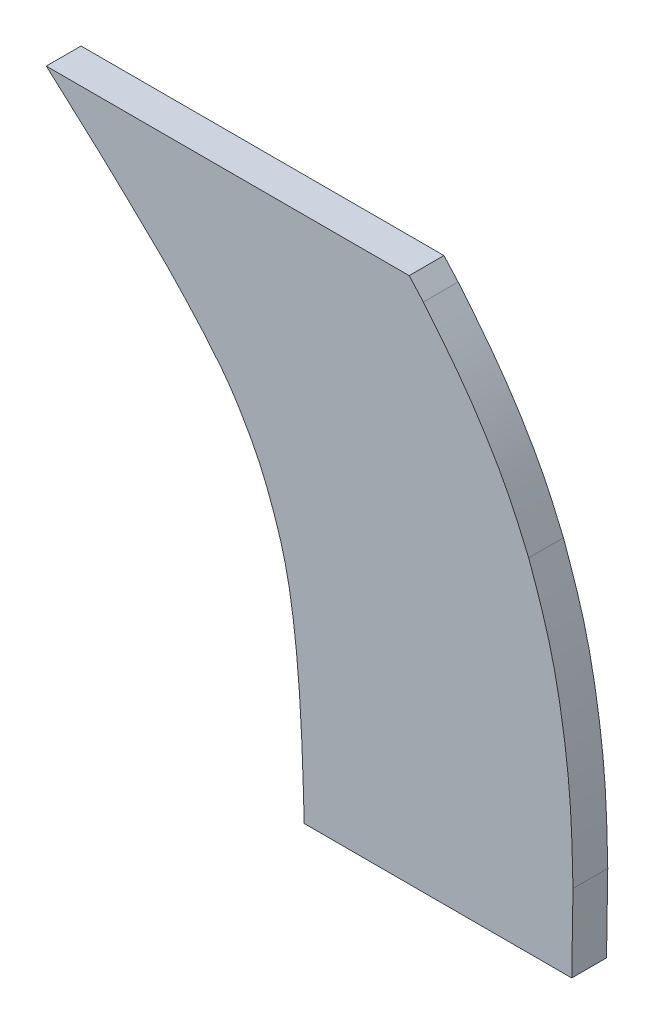
ISO-10303-21;
HEADER;
FILE_DESCRIPTION(('STEP AP214'),'2;1');
FILE_NAME('part.step','',(''),(''),'','','');
FILE_SCHEMA(('AUTOMOTIVE_DESIGN { 1 0 10303 214 1 1 1 1 }'));
ENDSEC;
DATA;
#1=APPLICATION_CONTEXT('core data for automotive mechanical design processes');
#2=APPLICATION_PROTOCOL_DEFINITION('international standard','automotive_design',2000,#1);
#3=PRODUCT_CONTEXT('',#1,'mechanical');
#4=PRODUCT('Part','Part','',(#3));
#5=PRODUCT_RELATED_PRODUCT_CATEGORY('part','',(#4));
#6=PRODUCT_DEFINITION_FORMATION('','',#4);
#7=PRODUCT_DEFINITION_CONTEXT('part definition',#1,'design');
#8=PRODUCT_DEFINITION('design','',#6,#7);
#9=PRODUCT_DEFINITION_SHAPE('','',#8);
#10=(LENGTH_UNIT() NAMED_UNIT(*) SI_UNIT(.MILLI.,.METRE.));
#11=(NAMED_UNIT(*) PLANE_ANGLE_UNIT() SI_UNIT($,.RADIAN.));
#12=(NAMED_UNIT(*) SI_UNIT($,.STERADIAN.) SOLID_ANGLE_UNIT());
#13=UNCERTAINTY_MEASURE_WITH_UNIT(LENGTH_MEASURE(1.E-05),#10,'distance_accuracy_value','');
#14=(GEOMETRIC_REPRESENTATION_CONTEXT(3) GLOBAL_UNCERTAINTY_ASSIGNED_CONTEXT((#13)) GLOBAL_UNIT_ASSIGNED_CONTEXT((#10,
#11,#12)) REPRESENTATION_CONTEXT('',''));
#15=CARTESIAN_POINT('',(0.,0.,0.));
#16=DIRECTION('',(0.,0.,1.));
#17=DIRECTION('',(1.,0.,0.));
#18=AXIS2_PLACEMENT_3D('',#15,#16,#17);
#19=CARTESIAN_POINT('',(1.68870192307694,-3.15504807692308,0.5));
#20=CARTESIAN_POINT('',(1.60232763222018,-2.95289779767821,0.5));
#21=CARTESIAN_POINT('',(1.42460448924147,-2.53695478240067,0.5));
#22=CARTESIAN_POINT('',(1.07669462399531,-1.93136088188836,0.5));
#23=CARTESIAN_POINT('',(0.660414537092791,-1.32069011766099,0.5));
#24=CARTESIAN_POINT('',(0.339681018973926,-0.929104196150406,0.5));
#25=CARTESIAN_POINT('',(0.174278846153862,-0.727163461538463,0.5));
#26=B_SPLINE_CURVE_WITH_KNOTS('',3,(#19,#20,#21,#22,#23,#24,#25),.UNSPECIFIED.,.F.,.F.,(4,1,1,1,
4),(0.,0.229314447401135,0.471835819643835,0.727625900937919,1.),.UNSPECIFIED.);
#27=DIRECTION('',(0.,0.,-1.));
#28=VECTOR('',#27,1.);
#29=SURFACE_OF_LINEAR_EXTRUSION('',#26,#28);
#30=CARTESIAN_POINT('',(1.68870192307694,-3.15504807692308,0.));
#31=CARTESIAN_POINT('',(1.60232763222018,-2.95289779767821,0.));
#32=CARTESIAN_POINT('',(1.42460448924147,-2.53695478240067,0.));
#33=CARTESIAN_POINT('',(1.07669462399531,-1.93136088188836,0.));
#34=CARTESIAN_POINT('',(0.660414537092791,-1.32069011766099,0.));
#35=CARTESIAN_POINT('',(0.339681018973926,-0.929104196150406,0.));
#36=CARTESIAN_POINT('',(0.174278846153862,-0.727163461538463,0.));
#37=B_SPLINE_CURVE_WITH_KNOTS('',3,(#30,#31,#32,#33,#34,#35,#36),.UNSPECIFIED.,.F.,.F.,(4,1,1,1,
4),(0.,0.229314447401135,0.471835819643835,0.727625900937919,1.),.UNSPECIFIED.);
#38=CARTESIAN_POINT('',(1.68870192307694,-3.15504807692308,0.));
#39=VERTEX_POINT('',#38);
#40=CARTESIAN_POINT('',(0.174278846153862,-0.727163461538463,0.));
#41=VERTEX_POINT('',#40);
#42=EDGE_CURVE('E118',#39,#41,#37,.T.);
#43=ORIENTED_EDGE('',*,*,#42,.T.);
#44=DIRECTION('',(0.,0.,-1.));
#45=VECTOR('',#44,1.);
#46=CARTESIAN_POINT('',(0.174278846153862,-0.727163461538463,0.5));
#47=LINE('',#46,#45);
#48=CARTESIAN_POINT('',(0.174278846153862,-0.727163461538463,0.5));
#49=VERTEX_POINT('',#48);
#50=EDGE_CURVE('E116',#49,#41,#47,.T.);
#51=ORIENTED_EDGE('',*,*,#50,.F.);
#52=CARTESIAN_POINT('',(1.68870192307694,-3.15504807692308,0.5));
#53=VERTEX_POINT('',#52);
#54=EDGE_CURVE('E201',#53,#49,#26,.T.);
#55=ORIENTED_EDGE('',*,*,#54,.F.);
#56=DIRECTION('',(0.,0.,-1.));
#57=VECTOR('',#56,1.);
#58=CARTESIAN_POINT('',(1.68870192307694,-3.15504807692308,0.5));
#59=LINE('',#58,#57);
#60=EDGE_CURVE('E152',#53,#39,#59,.T.);
#61=ORIENTED_EDGE('',*,*,#60,.T.);
#62=EDGE_LOOP('',(#43,#51,#55,#61));
#63=FACE_BOUND('',#62,.T.);
#64=ADVANCED_FACE('F39',(#63),#29,.F.);
#65=CARTESIAN_POINT('',(2.32572115384617,-6.953125,0.5));
#66=CARTESIAN_POINT('',(2.31796427184218,-6.59813381025928,0.5));
#67=CARTESIAN_POINT('',(2.30297263097523,-5.91204622702826,0.5));
#68=CARTESIAN_POINT('',(2.17906008741319,-4.92115731738626,0.5));
#69=CARTESIAN_POINT('',(1.9903794108285,-4.00207443127874,0.5));
#70=CARTESIAN_POINT('',(1.78721405775447,-3.43164271087344,0.5));
#71=CARTESIAN_POINT('',(1.68870192307694,-3.15504807692308,0.5));
#72=B_SPLINE_CURVE_WITH_KNOTS('',3,(#65,#66,#67,#68,#69,#70,#71),.UNSPECIFIED.,.F.,.F.,(4,1,1,1,
4),(0.,0.274928014115547,0.531350360849249,0.772758122041731,1.),.UNSPECIFIED.);
#73=DIRECTION('',(0.,0.,-1.));
#74=VECTOR('',#73,1.);
#75=SURFACE_OF_LINEAR_EXTRUSION('',#72,#74);
#76=CARTESIAN_POINT('',(2.32572115384617,-6.953125,0.));
#77=CARTESIAN_POINT('',(2.31796427184218,-6.59813381025928,0.));
#78=CARTESIAN_POINT('',(2.30297263097523,-5.91204622702826,0.));
#79=CARTESIAN_POINT('',(2.17906008741319,-4.92115731738626,0.));
#80=CARTESIAN_POINT('',(1.9903794108285,-4.00207443127874,0.));
#81=CARTESIAN_POINT('',(1.78721405775447,-3.43164271087344,0.));
#82=CARTESIAN_POINT('',(1.68870192307694,-3.15504807692308,0.));
#83=B_SPLINE_CURVE_WITH_KNOTS('',3,(#76,#77,#78,#79,#80,#81,#82),.UNSPECIFIED.,.F.,.F.,(4,1,1,1,
4),(0.,0.274928014115547,0.531350360849249,0.772758122041731,1.),.UNSPECIFIED.);
#84=CARTESIAN_POINT('',(2.32572115384617,-6.953125,0.));
#85=VERTEX_POINT('',#84);
#86=EDGE_CURVE('E125',#85,#39,#83,.T.);
#87=ORIENTED_EDGE('',*,*,#86,.T.);
#88=ORIENTED_EDGE('',*,*,#60,.F.);
#89=CARTESIAN_POINT('',(2.32572115384617,-6.953125,0.5));
#90=VERTEX_POINT('',#89);
#91=EDGE_CURVE('E213',#90,#53,#72,.T.);
#92=ORIENTED_EDGE('',*,*,#91,.F.);
#93=DIRECTION('',(0.,0.,-1.));
#94=VECTOR('',#93,1.);
#95=CARTESIAN_POINT('',(2.32572115384617,-6.953125,0.5));
#96=LINE('',#95,#94);
#97=EDGE_CURVE('E149',#90,#85,#96,.T.);
#98=ORIENTED_EDGE('',*,*,#97,.T.);
#99=EDGE_LOOP('',(#87,#88,#92,#98));
#100=FACE_BOUND('',#99,.T.);
#101=ADVANCED_FACE('F230',(#100),#75,.F.);
#102=CARTESIAN_POINT('',(2.30769230769232,-8.07692307692308,0.5));
#103=CARTESIAN_POINT('',(2.31205045037917,-7.85857919950495,0.5));
#104=CARTESIAN_POINT('',(2.31952699537485,-7.48400270182074,0.5));
#105=CARTESIAN_POINT('',(2.32389803217099,-7.10937780650145,0.5));
#106=CARTESIAN_POINT('',(2.32572115384617,-6.953125,0.5));
#107=B_SPLINE_CURVE_WITH_KNOTS('',3,(#102,#103,#104,#105,#106),.UNSPECIFIED.,.F.,.F.,(4,1,4),
(0.,0.582908641540579,1.),.UNSPECIFIED.);
#108=DIRECTION('',(0.,0.,-1.));
#109=VECTOR('',#108,1.);
#110=SURFACE_OF_LINEAR_EXTRUSION('',#107,#109);
#111=CARTESIAN_POINT('',(2.30769230769232,-8.07692307692308,0.));
#112=CARTESIAN_POINT('',(2.31205045037917,-7.85857919950495,0.));
#113=CARTESIAN_POINT('',(2.31952699537485,-7.48400270182074,0.));
#114=CARTESIAN_POINT('',(2.32389803217099,-7.10937780650145,0.));
#115=CARTESIAN_POINT('',(2.32572115384617,-6.953125,0.));
#116=B_SPLINE_CURVE_WITH_KNOTS('',3,(#111,#112,#113,#114,#115),.UNSPECIFIED.,.F.,.F.,(4,1,4),
(0.,0.582908641540579,1.),.UNSPECIFIED.);
#117=CARTESIAN_POINT('',(2.30769230769232,-8.07692307692308,0.));
#118=VERTEX_POINT('',#117);
#119=EDGE_CURVE('E243',#118,#85,#116,.T.);
#120=ORIENTED_EDGE('',*,*,#119,.T.);
#121=ORIENTED_EDGE('',*,*,#97,.F.);
#122=CARTESIAN_POINT('',(2.30769230769232,-8.07692307692308,0.5));
#123=VERTEX_POINT('',#122);
#124=EDGE_CURVE('E219',#123,#90,#107,.T.);
#125=ORIENTED_EDGE('',*,*,#124,.F.);
#126=DIRECTION('',(0.,0.,-1.));
#127=VECTOR('',#126,1.);
#128=CARTESIAN_POINT('',(2.30769230769232,-8.07692307692308,0.5));
#129=LINE('',#128,#127);
#130=EDGE_CURVE('E47',#123,#118,#129,.T.);
#131=ORIENTED_EDGE('',*,*,#130,.T.);
#132=EDGE_LOOP('',(#120,#121,#125,#131));
#133=FACE_BOUND('',#132,.T.);
#134=ADVANCED_FACE('F227',(#133),#110,.F.);
#135=CARTESIAN_POINT('',(-1.53846153846152,-8.07692307692308,0.5));
#136=DIRECTION('',(0.,1.,0.));
#137=DIRECTION('',(0.,0.,1.));
#138=AXIS2_PLACEMENT_3D('',#135,#136,#137);
#139=PLANE('',#138);
#140=DIRECTION('',(1.,0.,0.));
#141=VECTOR('',#140,1.);
#142=CARTESIAN_POINT('',(-1.53846153846152,-8.07692307692308,0.));
#143=LINE('',#142,#141);
#144=CARTESIAN_POINT('',(-1.53846153846152,-8.07692307692308,0.));
#145=VERTEX_POINT('',#144);
#146=EDGE_CURVE('E107',#145,#118,#143,.T.);
#147=ORIENTED_EDGE('',*,*,#146,.T.);
#148=ORIENTED_EDGE('',*,*,#130,.F.);
#149=DIRECTION('',(1.,0.,0.));
#150=VECTOR('',#149,1.);
#151=CARTESIAN_POINT('',(-1.53846153846152,-8.07692307692308,0.5));
#152=LINE('',#151,#150);
#153=CARTESIAN_POINT('',(-1.53846153846152,-8.07692307692308,0.5));
#154=VERTEX_POINT('',#153);
#155=EDGE_CURVE('E256',#154,#123,#152,.T.);
#156=ORIENTED_EDGE('',*,*,#155,.F.);
#157=DIRECTION('',(0.,0.,-1.));
#158=VECTOR('',#157,1.);
#159=CARTESIAN_POINT('',(-1.53846153846152,-8.07692307692308,0.5));
#160=LINE('',#159,#158);
#161=EDGE_CURVE('E160',#154,#145,#160,.T.);
#162=ORIENTED_EDGE('',*,*,#161,.T.);
#163=EDGE_LOOP('',(#147,#148,#156,#162));
#164=FACE_BOUND('',#163,.T.);
#165=ADVANCED_FACE('F41',(#164),#139,.F.);
#166=CARTESIAN_POINT('',(-5.04807692307691,-0.67908653846154,0.5));
#167=CARTESIAN_POINT('',(-4.90368534601218,-0.809107376099954,0.5));
#168=CARTESIAN_POINT('',(-4.62551254435876,-1.05959470655545,0.5));
#169=CARTESIAN_POINT('',(-4.22779883738874,-1.42304971681978,0.5));
#170=CARTESIAN_POINT('',(-3.87803267503722,-1.76869920695732,0.5));
#171=CARTESIAN_POINT('',(-3.55255317793362,-2.07217325874222,0.5));
#172=CARTESIAN_POINT('',(-3.28007793907462,-2.36082818712014,0.5));
#173=CARTESIAN_POINT('',(-3.04221671604907,-2.62013020696313,0.5));
#174=CARTESIAN_POINT('',(-2.84582542706802,-2.85426776546625,0.5));
#175=CARTESIAN_POINT('',(-2.62645535125399,-3.12362356381901,0.5));
#176=CARTESIAN_POINT('',(-2.41006632825114,-3.4682993783295,0.5));
#177=CARTESIAN_POINT('',(-2.1767170662385,-3.89257628938993,0.5));
#178=CARTESIAN_POINT('',(-1.99494127263021,-4.35511678292371,0.5));
#179=CARTESIAN_POINT('',(-1.82704843280044,-4.85981415090261,0.5));
#180=CARTESIAN_POINT('',(-1.70826736927876,-5.46273270330076,0.5));
#181=CARTESIAN_POINT('',(-1.62325467335431,-6.19593829041788,0.5));
#182=CARTESIAN_POINT('',(-1.56618741980453,-7.08459474940085,0.5));
#183=CARTESIAN_POINT('',(-1.54820264233609,-7.72828228183067,0.5));
#184=CARTESIAN_POINT('',(-1.53846153846152,-8.07692307692308,0.5));
#185=B_SPLINE_CURVE_WITH_KNOTS('',3,(#166,#167,#168,#169,#170,#171,#172,#173,#174,#175,#176,
#177,#178,#179,#180,#181,#182,#183,#184),.UNSPECIFIED.,.F.,.F.,(4,1,1,1,1,1,1,1,1,1,1,1,1,1,1,1,
4),(0.,0.0678143802654593,0.130645544112154,0.187998736302446,0.239420704509847,
0.285900177766897,0.326485127592665,0.362201744583584,0.392555032416286,0.447625777948467,
0.503925344749419,0.561308356256565,0.620782657638053,0.689338944965152,0.775273518007204,
0.87828128492013,1.),.UNSPECIFIED.);
#186=DIRECTION('',(0.,0.,-1.));
#187=VECTOR('',#186,1.);
#188=SURFACE_OF_LINEAR_EXTRUSION('',#185,#187);
#189=CARTESIAN_POINT('',(-5.04807692307691,-0.67908653846154,0.));
#190=CARTESIAN_POINT('',(-4.90368534601218,-0.809107376099954,0.));
#191=CARTESIAN_POINT('',(-4.62551254435876,-1.05959470655545,0.));
#192=CARTESIAN_POINT('',(-4.22779883738874,-1.42304971681978,0.));
#193=CARTESIAN_POINT('',(-3.87803267503722,-1.76869920695732,0.));
#194=CARTESIAN_POINT('',(-3.55255317793362,-2.07217325874222,0.));
#195=CARTESIAN_POINT('',(-3.28007793907462,-2.36082818712014,0.));
#196=CARTESIAN_POINT('',(-3.04221671604907,-2.62013020696313,0.));
#197=CARTESIAN_POINT('',(-2.84582542706802,-2.85426776546625,0.));
#198=CARTESIAN_POINT('',(-2.62645535125399,-3.12362356381901,0.));
#199=CARTESIAN_POINT('',(-2.41006632825114,-3.4682993783295,0.));
#200=CARTESIAN_POINT('',(-2.1767170662385,-3.89257628938993,0.));
#201=CARTESIAN_POINT('',(-1.99494127263021,-4.35511678292371,0.));
#202=CARTESIAN_POINT('',(-1.82704843280044,-4.85981415090261,0.));
#203=CARTESIAN_POINT('',(-1.70826736927876,-5.46273270330076,0.));
#204=CARTESIAN_POINT('',(-1.62325467335431,-6.19593829041788,0.));
#205=CARTESIAN_POINT('',(-1.56618741980453,-7.08459474940085,0.));
#206=CARTESIAN_POINT('',(-1.54820264233609,-7.72828228183067,0.));
#207=CARTESIAN_POINT('',(-1.53846153846152,-8.07692307692308,0.));
#208=B_SPLINE_CURVE_WITH_KNOTS('',3,(#189,#190,#191,#192,#193,#194,#195,#196,#197,#198,#199,
#200,#201,#202,#203,#204,#205,#206,#207),.UNSPECIFIED.,.F.,.F.,(4,1,1,1,1,1,1,1,1,1,1,1,1,1,1,1,
4),(0.,0.0678143802654593,0.130645544112154,0.187998736302446,0.239420704509847,
0.285900177766897,0.326485127592665,0.362201744583584,0.392555032416286,0.447625777948467,
0.503925344749419,0.561308356256565,0.620782657638053,0.689338944965152,0.775273518007204,
0.87828128492013,1.),.UNSPECIFIED.);
#209=CARTESIAN_POINT('',(-5.04807692307691,-0.67908653846154,0.));
#210=VERTEX_POINT('',#209);
#211=EDGE_CURVE('E122',#210,#145,#208,.T.);
#212=ORIENTED_EDGE('',*,*,#211,.T.);
#213=ORIENTED_EDGE('',*,*,#161,.F.);
#214=CARTESIAN_POINT('',(-5.04807692307691,-0.67908653846154,0.5));
#215=VERTEX_POINT('',#214);
#216=EDGE_CURVE('E159',#215,#154,#185,.T.);
#217=ORIENTED_EDGE('',*,*,#216,.F.);
#218=DIRECTION('',(0.,0.,-1.));
#219=VECTOR('',#218,1.);
#220=CARTESIAN_POINT('',(-5.04807692307691,-0.67908653846154,0.5));
#221=LINE('',#220,#219);
#222=EDGE_CURVE('E153',#215,#210,#221,.T.);
#223=ORIENTED_EDGE('',*,*,#222,.T.);
#224=EDGE_LOOP('',(#212,#213,#217,#223));
#225=FACE_BOUND('',#224,.T.);
#226=ADVANCED_FACE('F184',(#225),#188,.F.);
#227=CARTESIAN_POINT('',(2.31824117430215,-7.51504795191898,0.5));
#228=DIRECTION('',(0.,0.,-1.));
#229=DIRECTION('',(-1.,0.,0.));
#230=AXIS2_PLACEMENT_3D('',#227,#228,#229);
#231=PLANE('',#230);
#232=CARTESIAN_POINT('',(0.174278846153862,-0.727163461538463,0.5));
#233=CARTESIAN_POINT('',(0.104379550291745,-0.648850490465537,0.5));
#234=CARTESIAN_POINT('',(-0.045742355823704,-0.480658631791847,0.5));
#235=CARTESIAN_POINT('',(-0.29113487059763,-0.215189631286869,0.5));
#236=CARTESIAN_POINT('',(-0.580472868697672,0.0706440784369072,0.5));
#237=CARTESIAN_POINT('',(-0.904826844471692,0.383369833470368,0.5));
#238=CARTESIAN_POINT('',(-1.26786361250698,0.721514611585081,0.5));
#239=CARTESIAN_POINT('',(-1.66886042913075,1.08573545993146,0.5));
#240=CARTESIAN_POINT('',(-2.10733499095428,1.47898015973117,0.5));
#241=CARTESIAN_POINT('',(-2.57996236240517,1.87862434507439,0.5));
#242=CARTESIAN_POINT('',(-3.03989044013833,2.29050165337768,0.5));
#243=CARTESIAN_POINT('',(-3.47745383321435,2.67992913892365,0.5));
#244=CARTESIAN_POINT('',(-3.86587046467265,3.05310426266962,0.5));
#245=CARTESIAN_POINT('',(-4.21554668744453,3.39885295343115,0.5));
#246=CARTESIAN_POINT('',(-4.51686073317424,3.72496446556832,0.5));
#247=CARTESIAN_POINT('',(-4.77576595325133,4.02530742447659,0.5));
#248=CARTESIAN_POINT('',(-4.99460510227963,4.29918836186116,0.5));
#249=CARTESIAN_POINT('',(-5.2191179143057,4.63819307085225,0.5));
#250=CARTESIAN_POINT('',(-5.44355125811733,5.05586246312233,0.5));
#251=CARTESIAN_POINT('',(-5.63023139592506,5.58066146372215,0.5));
#252=CARTESIAN_POINT('',(-5.75092532088114,6.12630622043596,0.5));
#253=CARTESIAN_POINT('',(-5.76308090749268,6.49976059002287,0.5));
#254=CARTESIAN_POINT('',(-5.76923076923075,6.68870192307692,0.5));
#255=B_SPLINE_CURVE_WITH_KNOTS('',3,(#232,#233,#234,#235,#236,#237,#238,#239,#240,#241,#242,
#243,#244,#245,#246,#247,#248,#249,#250,#251,#252,#253,#254),.UNSPECIFIED.,.F.,.F.,(4,1,1,1,1,1,
1,1,1,1,1,1,1,1,1,1,1,1,1,1,4),(0.,0.0322310690575655,0.0692222927768105,0.110974619220364,
0.157084351643919,0.207565065006248,0.263295960672411,0.323415696376189,0.388395141471602,
0.453316340369315,0.512978116543887,0.568228373472554,0.618679101258514,0.663944231265397,
0.704506211403094,0.740433873332112,0.771481196059508,0.829261763324265,0.885489376099478,
0.942065773785035,1.),.UNSPECIFIED.);
#256=CARTESIAN_POINT('',(-0.02951827521679,-0.5,0.5));
#257=VERTEX_POINT('',#256);
#258=EDGE_CURVE('E169',#49,#257,#255,.T.);
#259=ORIENTED_EDGE('',*,*,#258,.T.);
#260=DIRECTION('',(-1.,0.,0.));
#261=VECTOR('',#260,1.);
#262=CARTESIAN_POINT('',(2.31824117430215,-0.5,0.5));
#263=LINE('',#262,#261);
#264=CARTESIAN_POINT('',(-5.247467263494,-0.500000001745894,0.5));
#265=VERTEX_POINT('',#264);
#266=EDGE_CURVE('E102',#257,#265,#263,.T.);
#267=ORIENTED_EDGE('',*,*,#266,.T.);
#268=CARTESIAN_POINT('',(-9.6153846153846,7.08533653846154,0.5));
#269=CARTESIAN_POINT('',(-9.60389301856012,6.75797579590921,0.5));
#270=CARTESIAN_POINT('',(-9.58123590042242,6.11254321321944,0.5));
#271=CARTESIAN_POINT('',(-9.39918084325723,5.16596193693734,0.5));
#272=CARTESIAN_POINT('',(-9.11340108879337,4.25680371032432,0.5));
#273=CARTESIAN_POINT('',(-8.7639340038743,3.53368819405655,0.5));
#274=CARTESIAN_POINT('',(-8.42372985010389,2.95682003936723,0.5));
#275=CARTESIAN_POINT('',(-8.09929652395903,2.50973408455943,0.5));
#276=CARTESIAN_POINT('',(-7.73327862909316,2.0308320673421,0.5));
#277=CARTESIAN_POINT('',(-7.30446324529288,1.53271603087338,0.5));
#278=CARTESIAN_POINT('',(-6.81678447837605,1.01401065917077,0.5));
#279=CARTESIAN_POINT('',(-6.28127267708572,0.463462546866536,0.5));
#280=CARTESIAN_POINT('',(-5.68757216973112,-0.105316940384008,0.5));
#281=CARTESIAN_POINT('',(-5.26553019510752,-0.48398254488782,0.5));
#282=CARTESIAN_POINT('',(-5.04807692307691,-0.67908653846154,0.5));
#283=B_SPLINE_CURVE_WITH_KNOTS('',3,(#268,#269,#270,#271,#272,#273,#274,#275,#276,#277,#278,
#279,#280,#281,#282),.UNSPECIFIED.,.F.,.F.,(4,1,1,1,1,1,1,1,1,1,1,1,4),(0.,0.105240132868083,
0.207494063674428,0.308987716506333,0.411030235834405,0.465074341040456,0.524257047302949,
0.588577825583629,0.658965763752887,0.73556935018822,0.817597390457212,0.906018721698534,1.),.UNSPECIFIED.);
#284=EDGE_CURVE('E163',#265,#215,#283,.T.);
#285=ORIENTED_EDGE('',*,*,#284,.T.);
#286=ORIENTED_EDGE('',*,*,#216,.T.);
#287=ORIENTED_EDGE('',*,*,#155,.T.);
#288=ORIENTED_EDGE('',*,*,#124,.T.);
#289=ORIENTED_EDGE('',*,*,#91,.T.);
#290=ORIENTED_EDGE('',*,*,#54,.T.);
#291=EDGE_LOOP('',(#259,#267,#285,#286,#287,#288,#289,#290));
#292=FACE_BOUND('',#291,.T.);
#293=ADVANCED_FACE('F188',(#292),#231,.F.);
#294=DIRECTION('',(0.,0.,-1.));
#295=VECTOR('',#294,1.);
#296=SURFACE_OF_LINEAR_EXTRUSION('',#283,#295);
#297=ORIENTED_EDGE('',*,*,#284,.F.);
#298=DIRECTION('',(0.,0.,-1.));
#299=VECTOR('',#298,1.);
#300=CARTESIAN_POINT('',(-5.24746726543373,-0.5,0.5));
#301=LINE('',#300,#299);
#302=CARTESIAN_POINT('',(-5.24693192040835,-0.5,-1.2E-05));
#303=VERTEX_POINT('',#302);
#304=EDGE_CURVE('E54',#265,#303,#301,.T.);
#305=ORIENTED_EDGE('',*,*,#304,.T.);
#306=CARTESIAN_POINT('',(-9.6153846153846,7.08533653846154,0.));
#307=CARTESIAN_POINT('',(-9.60389301856012,6.75797579590921,0.));
#308=CARTESIAN_POINT('',(-9.58123590042242,6.11254321321944,0.));
#309=CARTESIAN_POINT('',(-9.39918084325723,5.16596193693734,0.));
#310=CARTESIAN_POINT('',(-9.11340108879337,4.25680371032432,0.));
#311=CARTESIAN_POINT('',(-8.7639340038743,3.53368819405655,0.));
#312=CARTESIAN_POINT('',(-8.42372985010389,2.95682003936723,0.));
#313=CARTESIAN_POINT('',(-8.09929652395903,2.50973408455943,0.));
#314=CARTESIAN_POINT('',(-7.73327862909316,2.0308320673421,0.));
#315=CARTESIAN_POINT('',(-7.30446324529288,1.53271603087338,0.));
#316=CARTESIAN_POINT('',(-6.81678447837605,1.01401065917077,0.));
#317=CARTESIAN_POINT('',(-6.28127267708572,0.463462546866536,0.));
#318=CARTESIAN_POINT('',(-5.68757216973112,-0.105316940384008,0.));
#319=CARTESIAN_POINT('',(-5.26553019510752,-0.48398254488782,0.));
#320=CARTESIAN_POINT('',(-5.04807692307691,-0.67908653846154,0.));
#321=B_SPLINE_CURVE_WITH_KNOTS('',3,(#306,#307,#308,#309,#310,#311,#312,#313,#314,#315,#316,
#317,#318,#319,#320),.UNSPECIFIED.,.F.,.F.,(4,1,1,1,1,1,1,1,1,1,1,1,4),(0.,0.105240132868083,
0.207494063674428,0.308987716506333,0.411030235834405,0.465074341040456,0.524257047302949,
0.588577825583629,0.658965763752887,0.73556935018822,0.817597390457212,0.906018721698534,1.),.UNSPECIFIED.);
#322=EDGE_CURVE('E113',#303,#210,#321,.T.);
#323=ORIENTED_EDGE('',*,*,#322,.T.);
#324=ORIENTED_EDGE('',*,*,#222,.F.);
#325=EDGE_LOOP('',(#297,#305,#323,#324));
#326=FACE_BOUND('',#325,.T.);
#327=ADVANCED_FACE('F195',(#326),#296,.F.);
#328=DIRECTION('',(0.,0.,-1.));
#329=VECTOR('',#328,1.);
#330=SURFACE_OF_LINEAR_EXTRUSION('',#255,#329);
#331=CARTESIAN_POINT('',(0.174278846153862,-0.727163461538463,0.));
#332=CARTESIAN_POINT('',(0.104379550291745,-0.648850490465537,0.));
#333=CARTESIAN_POINT('',(-0.045742355823704,-0.480658631791847,0.));
#334=CARTESIAN_POINT('',(-0.29113487059763,-0.215189631286869,0.));
#335=CARTESIAN_POINT('',(-0.580472868697672,0.0706440784369072,0.));
#336=CARTESIAN_POINT('',(-0.904826844471692,0.383369833470368,0.));
#337=CARTESIAN_POINT('',(-1.26786361250698,0.721514611585081,0.));
#338=CARTESIAN_POINT('',(-1.66886042913075,1.08573545993146,0.));
#339=CARTESIAN_POINT('',(-2.10733499095428,1.47898015973117,0.));
#340=CARTESIAN_POINT('',(-2.57996236240517,1.87862434507439,0.));
#341=CARTESIAN_POINT('',(-3.03989044013833,2.29050165337768,0.));
#342=CARTESIAN_POINT('',(-3.47745383321435,2.67992913892365,0.));
#343=CARTESIAN_POINT('',(-3.86587046467265,3.05310426266962,0.));
#344=CARTESIAN_POINT('',(-4.21554668744453,3.39885295343115,0.));
#345=CARTESIAN_POINT('',(-4.51686073317424,3.72496446556832,0.));
#346=CARTESIAN_POINT('',(-4.77576595325133,4.02530742447659,0.));
#347=CARTESIAN_POINT('',(-4.99460510227963,4.29918836186116,0.));
#348=CARTESIAN_POINT('',(-5.2191179143057,4.63819307085225,0.));
#349=CARTESIAN_POINT('',(-5.44355125811733,5.05586246312233,0.));
#350=CARTESIAN_POINT('',(-5.63023139592506,5.58066146372215,0.));
#351=CARTESIAN_POINT('',(-5.75092532088114,6.12630622043596,0.));
#352=CARTESIAN_POINT('',(-5.76308090749268,6.49976059002287,0.));
#353=CARTESIAN_POINT('',(-5.76923076923075,6.68870192307692,0.));
#354=B_SPLINE_CURVE_WITH_KNOTS('',3,(#331,#332,#333,#334,#335,#336,#337,#338,#339,#340,#341,
#342,#343,#344,#345,#346,#347,#348,#349,#350,#351,#352,#353),.UNSPECIFIED.,.F.,.F.,(4,1,1,1,1,1,
1,1,1,1,1,1,1,1,1,1,1,1,1,1,4),(0.,0.0322310690575655,0.0692222927768105,0.110974619220364,
0.157084351643919,0.207565065006248,0.263295960672411,0.323415696376189,0.388395141471602,
0.453316340369315,0.512978116543887,0.568228373472554,0.618679101258514,0.663944231265397,
0.704506211403094,0.740433873332112,0.771481196059508,0.829261763324265,0.885489376099478,
0.942065773785035,1.),.UNSPECIFIED.);
#355=CARTESIAN_POINT('',(-0.0295182759099578,-0.500000000887488,0.));
#356=VERTEX_POINT('',#355);
#357=EDGE_CURVE('E111',#41,#356,#354,.T.);
#358=ORIENTED_EDGE('',*,*,#357,.T.);
#359=DIRECTION('',(0.,0.,-1.));
#360=VECTOR('',#359,1.);
#361=CARTESIAN_POINT('',(-0.0295182767143332,-0.5,0.5));
#362=LINE('',#361,#360);
#363=EDGE_CURVE('E98',#356,#257,#362,.F.);
#364=ORIENTED_EDGE('',*,*,#363,.T.);
#365=ORIENTED_EDGE('',*,*,#258,.F.);
#366=ORIENTED_EDGE('',*,*,#50,.T.);
#367=EDGE_LOOP('',(#358,#364,#365,#366));
#368=FACE_BOUND('',#367,.T.);
#369=ADVANCED_FACE('F119',(#368),#330,.F.);
#370=CARTESIAN_POINT('',(2.31824117430215,-7.51504795191898,0.));
#371=DIRECTION('',(0.,0.,-1.));
#372=DIRECTION('',(-1.,0.,0.));
#373=AXIS2_PLACEMENT_3D('',#370,#371,#372);
#374=PLANE('',#373);
#375=DIRECTION('',(-1.,0.,0.));
#376=VECTOR('',#375,1.);
#377=CARTESIAN_POINT('',(2.31824117430215,-0.5,0.));
#378=LINE('',#377,#376);
#379=EDGE_CURVE('E11',#356,#303,#378,.T.);
#380=ORIENTED_EDGE('',*,*,#379,.F.);
#381=ORIENTED_EDGE('',*,*,#357,.F.);
#382=ORIENTED_EDGE('',*,*,#42,.F.);
#383=ORIENTED_EDGE('',*,*,#86,.F.);
#384=ORIENTED_EDGE('',*,*,#119,.F.);
#385=ORIENTED_EDGE('',*,*,#146,.F.);
#386=ORIENTED_EDGE('',*,*,#211,.F.);
#387=ORIENTED_EDGE('',*,*,#322,.F.);
#388=EDGE_LOOP('',(#380,#381,#382,#383,#384,#385,#386,#387));
#389=FACE_BOUND('',#388,.T.);
#390=ADVANCED_FACE('F112',(#389),#374,.T.);
#391=CARTESIAN_POINT('',(-17.,-0.5,1.));
#392=DIRECTION('',(0.,-1.,0.));
#393=DIRECTION('',(0.,0.,-1.));
#394=AXIS2_PLACEMENT_3D('',#391,#392,#393);
#395=PLANE('',#394);
#396=ORIENTED_EDGE('',*,*,#379,.T.);
#397=ORIENTED_EDGE('',*,*,#304,.F.);
#398=ORIENTED_EDGE('',*,*,#266,.F.);
#399=ORIENTED_EDGE('',*,*,#363,.F.);
#400=EDGE_LOOP('',(#396,#397,#398,#399));
#401=FACE_BOUND('',#400,.T.);
#402=ADVANCED_FACE('F99',(#401),#395,.F.);
#403=CLOSED_SHELL('',(#64,#101,#134,#165,#226,#293,#327,#369,#390,#402));
#404=MANIFOLD_SOLID_BREP('B2',#403);
#405=ADVANCED_BREP_SHAPE_REPRESENTATION('',(#18,#404),#14);
#406=SHAPE_DEFINITION_REPRESENTATION(#9,#405);
ENDSEC;
END-ISO-10303-21;
